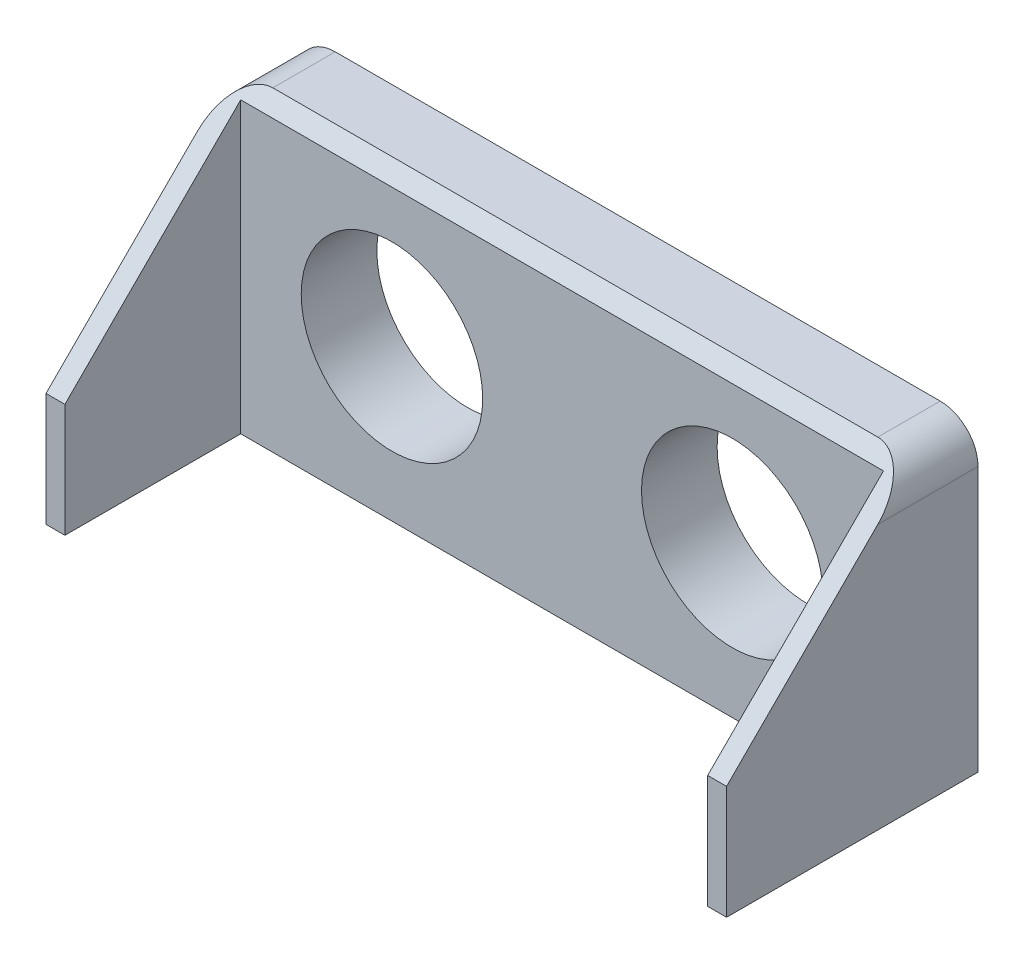
ISO-10303-21;
HEADER;
FILE_DESCRIPTION(('STEP AP214'),'2;1');
FILE_NAME('part.step','',(''),(''),'','','');
FILE_SCHEMA(('AUTOMOTIVE_DESIGN { 1 0 10303 214 1 1 1 1 }'));
ENDSEC;
DATA;
#1=APPLICATION_CONTEXT('core data for automotive mechanical design processes');
#2=APPLICATION_PROTOCOL_DEFINITION('international standard','automotive_design',2000,#1);
#3=PRODUCT_CONTEXT('',#1,'mechanical');
#4=PRODUCT('Part','Part','',(#3));
#5=PRODUCT_RELATED_PRODUCT_CATEGORY('part','',(#4));
#6=PRODUCT_DEFINITION_FORMATION('','',#4);
#7=PRODUCT_DEFINITION_CONTEXT('part definition',#1,'design');
#8=PRODUCT_DEFINITION('design','',#6,#7);
#9=PRODUCT_DEFINITION_SHAPE('','',#8);
#10=(LENGTH_UNIT() NAMED_UNIT(*) SI_UNIT(.MILLI.,.METRE.));
#11=(NAMED_UNIT(*) PLANE_ANGLE_UNIT() SI_UNIT($,.RADIAN.));
#12=(NAMED_UNIT(*) SI_UNIT($,.STERADIAN.) SOLID_ANGLE_UNIT());
#13=UNCERTAINTY_MEASURE_WITH_UNIT(LENGTH_MEASURE(1.E-05),#10,'distance_accuracy_value','');
#14=(GEOMETRIC_REPRESENTATION_CONTEXT(3) GLOBAL_UNCERTAINTY_ASSIGNED_CONTEXT((#13)) GLOBAL_UNIT_ASSIGNED_CONTEXT((#10,
#11,#12)) REPRESENTATION_CONTEXT('',''));
#15=CARTESIAN_POINT('',(0.,0.,0.));
#16=DIRECTION('',(0.,0.,1.));
#17=DIRECTION('',(1.,0.,0.));
#18=AXIS2_PLACEMENT_3D('',#15,#16,#17);
#19=CARTESIAN_POINT('',(1.,16.,0.));
#20=DIRECTION('',(0.,0.,-1.));
#21=DIRECTION('',(-1.,0.,0.));
#22=AXIS2_PLACEMENT_3D('',#19,#20,#21);
#23=PLANE('',#22);
#24=DIRECTION('',(0.,-1.,0.));
#25=VECTOR('',#24,1.);
#26=CARTESIAN_POINT('',(1.,16.,0.));
#27=LINE('',#26,#25);
#28=CARTESIAN_POINT('',(1.,5.99999999999997,0.));
#29=VERTEX_POINT('',#28);
#30=CARTESIAN_POINT('',(1.,0.,0.));
#31=VERTEX_POINT('',#30);
#32=EDGE_CURVE('E121',#29,#31,#27,.T.);
#33=ORIENTED_EDGE('',*,*,#32,.F.);
#34=DIRECTION('',(-1.,0.,0.));
#35=VECTOR('',#34,1.);
#36=CARTESIAN_POINT('',(1.,5.99999999999997,0.));
#37=LINE('',#36,#35);
#38=CARTESIAN_POINT('',(0.,5.99999999999997,0.));
#39=VERTEX_POINT('',#38);
#40=EDGE_CURVE('E194',#29,#39,#37,.T.);
#41=ORIENTED_EDGE('',*,*,#40,.T.);
#42=DIRECTION('',(0.,-1.,0.));
#43=VECTOR('',#42,1.);
#44=CARTESIAN_POINT('',(0.,16.,0.));
#45=LINE('',#44,#43);
#46=CARTESIAN_POINT('',(0.,0.,0.));
#47=VERTEX_POINT('',#46);
#48=EDGE_CURVE('E145',#39,#47,#45,.T.);
#49=ORIENTED_EDGE('',*,*,#48,.T.);
#50=DIRECTION('',(1.,0.,0.));
#51=VECTOR('',#50,1.);
#52=CARTESIAN_POINT('',(1.,0.,0.));
#53=LINE('',#52,#51);
#54=EDGE_CURVE('E139',#47,#31,#53,.T.);
#55=ORIENTED_EDGE('',*,*,#54,.T.);
#56=EDGE_LOOP('',(#33,#41,#49,#55));
#57=FACE_BOUND('',#56,.T.);
#58=ADVANCED_FACE('F37',(#57),#23,.F.);
#59=CARTESIAN_POINT('',(0.999999999999999,16.,-9.3));
#60=DIRECTION('',(-1.,0.,0.));
#61=DIRECTION('',(0.,0.,1.));
#62=AXIS2_PLACEMENT_3D('',#59,#60,#61);
#63=PLANE('',#62);
#64=DIRECTION('',(0.,-1.,0.));
#65=VECTOR('',#64,1.);
#66=CARTESIAN_POINT('',(0.999999999999999,16.,-9.3));
#67=LINE('',#66,#65);
#68=CARTESIAN_POINT('',(0.999999999999999,15.3,-9.3));
#69=VERTEX_POINT('',#68);
#70=CARTESIAN_POINT('',(0.999999999999999,0.,-9.3));
#71=VERTEX_POINT('',#70);
#72=EDGE_CURVE('E133',#69,#71,#67,.T.);
#73=ORIENTED_EDGE('',*,*,#72,.F.);
#74=DIRECTION('',(0.,0.707106781186549,-0.707106781186547));
#75=VECTOR('',#74,1.);
#76=CARTESIAN_POINT('',(0.999999999999999,16.,-10.));
#77=LINE('',#76,#75);
#78=EDGE_CURVE('E128',#69,#29,#77,.F.);
#79=ORIENTED_EDGE('',*,*,#78,.T.);
#80=ORIENTED_EDGE('',*,*,#32,.T.);
#81=DIRECTION('',(0.,0.,-1.));
#82=VECTOR('',#81,1.);
#83=CARTESIAN_POINT('',(0.999999999999999,0.,-9.3));
#84=LINE('',#83,#82);
#85=EDGE_CURVE('E125',#31,#71,#84,.T.);
#86=ORIENTED_EDGE('',*,*,#85,.T.);
#87=EDGE_LOOP('',(#73,#79,#80,#86));
#88=FACE_BOUND('',#87,.T.);
#89=ADVANCED_FACE('F124',(#88),#63,.F.);
#90=CARTESIAN_POINT('',(35.,16.,-9.3));
#91=DIRECTION('',(0.,0.,-1.));
#92=DIRECTION('',(-1.,0.,0.));
#93=AXIS2_PLACEMENT_3D('',#90,#91,#92);
#94=PLANE('',#93);
#95=CARTESIAN_POINT('',(27.,8.,-9.3));
#96=DIRECTION('',(0.,0.,-1.));
#97=DIRECTION('',(-1.,0.,0.));
#98=AXIS2_PLACEMENT_3D('',#95,#96,#97);
#99=CIRCLE('',#98,4.8);
#100=CARTESIAN_POINT('',(22.2,8.,-9.3));
#101=VERTEX_POINT('',#100);
#102=EDGE_CURVE('E147',#101,#101,#99,.T.);
#103=ORIENTED_EDGE('',*,*,#102,.T.);
#104=EDGE_LOOP('',(#103));
#105=FACE_BOUND('',#104,.T.);
#106=CARTESIAN_POINT('',(9.,8.,-9.3));
#107=DIRECTION('',(0.,0.,-1.));
#108=DIRECTION('',(-1.,0.,0.));
#109=AXIS2_PLACEMENT_3D('',#106,#107,#108);
#110=CIRCLE('',#109,4.8);
#111=CARTESIAN_POINT('',(4.2,8.,-9.3));
#112=VERTEX_POINT('',#111);
#113=EDGE_CURVE('E150',#112,#112,#110,.T.);
#114=ORIENTED_EDGE('',*,*,#113,.T.);
#115=EDGE_LOOP('',(#114));
#116=FACE_BOUND('',#115,.T.);
#117=DIRECTION('',(0.,-1.,0.));
#118=VECTOR('',#117,1.);
#119=CARTESIAN_POINT('',(35.,16.,-9.3));
#120=LINE('',#119,#118);
#121=CARTESIAN_POINT('',(35.,15.3,-9.3));
#122=VERTEX_POINT('',#121);
#123=CARTESIAN_POINT('',(35.,0.,-9.3));
#124=VERTEX_POINT('',#123);
#125=EDGE_CURVE('E179',#122,#124,#120,.T.);
#126=ORIENTED_EDGE('',*,*,#125,.F.);
#127=DIRECTION('',(1.,0.,0.));
#128=VECTOR('',#127,1.);
#129=CARTESIAN_POINT('',(0.,15.3,-9.3));
#130=LINE('',#129,#128);
#131=EDGE_CURVE('E191',#122,#69,#130,.F.);
#132=ORIENTED_EDGE('',*,*,#131,.T.);
#133=ORIENTED_EDGE('',*,*,#72,.T.);
#134=DIRECTION('',(1.,0.,0.));
#135=VECTOR('',#134,1.);
#136=CARTESIAN_POINT('',(35.,0.,-9.3));
#137=LINE('',#136,#135);
#138=EDGE_CURVE('E142',#71,#124,#137,.T.);
#139=ORIENTED_EDGE('',*,*,#138,.T.);
#140=EDGE_LOOP('',(#126,#132,#133,#139));
#141=FACE_BOUND('',#140,.T.);
#142=ADVANCED_FACE('F239',(#105,#116,#141),#94,.F.);
#143=CARTESIAN_POINT('',(35.,16.,0.));
#144=DIRECTION('',(1.,0.,0.));
#145=DIRECTION('',(0.,0.,-1.));
#146=AXIS2_PLACEMENT_3D('',#143,#144,#145);
#147=PLANE('',#146);
#148=DIRECTION('',(0.,-1.,0.));
#149=VECTOR('',#148,1.);
#150=CARTESIAN_POINT('',(35.,16.,0.));
#151=LINE('',#150,#149);
#152=CARTESIAN_POINT('',(35.,5.99999999999997,0.));
#153=VERTEX_POINT('',#152);
#154=CARTESIAN_POINT('',(35.,0.,0.));
#155=VERTEX_POINT('',#154);
#156=EDGE_CURVE('E177',#153,#155,#151,.T.);
#157=ORIENTED_EDGE('',*,*,#156,.F.);
#158=DIRECTION('',(0.,-0.707106781186549,0.707106781186547));
#159=VECTOR('',#158,1.);
#160=CARTESIAN_POINT('',(35.,16.,-10.));
#161=LINE('',#160,#159);
#162=EDGE_CURVE('E188',#153,#122,#161,.F.);
#163=ORIENTED_EDGE('',*,*,#162,.T.);
#164=ORIENTED_EDGE('',*,*,#125,.T.);
#165=DIRECTION('',(0.,0.,1.));
#166=VECTOR('',#165,1.);
#167=CARTESIAN_POINT('',(35.,0.,0.));
#168=LINE('',#167,#166);
#169=EDGE_CURVE('E156',#124,#155,#168,.T.);
#170=ORIENTED_EDGE('',*,*,#169,.T.);
#171=EDGE_LOOP('',(#157,#163,#164,#170));
#172=FACE_BOUND('',#171,.T.);
#173=ADVANCED_FACE('F238',(#172),#147,.F.);
#174=CARTESIAN_POINT('',(36.,16.,0.));
#175=DIRECTION('',(0.,0.,-1.));
#176=DIRECTION('',(-1.,0.,0.));
#177=AXIS2_PLACEMENT_3D('',#174,#175,#176);
#178=PLANE('',#177);
#179=DIRECTION('',(0.,-1.,0.));
#180=VECTOR('',#179,1.);
#181=CARTESIAN_POINT('',(36.,16.,0.));
#182=LINE('',#181,#180);
#183=CARTESIAN_POINT('',(36.,5.99999999999997,0.));
#184=VERTEX_POINT('',#183);
#185=CARTESIAN_POINT('',(36.,0.,0.));
#186=VERTEX_POINT('',#185);
#187=EDGE_CURVE('E175',#184,#186,#182,.T.);
#188=ORIENTED_EDGE('',*,*,#187,.F.);
#189=DIRECTION('',(-1.,0.,0.));
#190=VECTOR('',#189,1.);
#191=CARTESIAN_POINT('',(36.,5.99999999999997,0.));
#192=LINE('',#191,#190);
#193=EDGE_CURVE('E186',#184,#153,#192,.T.);
#194=ORIENTED_EDGE('',*,*,#193,.T.);
#195=ORIENTED_EDGE('',*,*,#156,.T.);
#196=DIRECTION('',(1.,0.,0.));
#197=VECTOR('',#196,1.);
#198=CARTESIAN_POINT('',(36.,0.,0.));
#199=LINE('',#198,#197);
#200=EDGE_CURVE('E159',#155,#186,#199,.T.);
#201=ORIENTED_EDGE('',*,*,#200,.T.);
#202=EDGE_LOOP('',(#188,#194,#195,#201));
#203=FACE_BOUND('',#202,.T.);
#204=ADVANCED_FACE('F241',(#203),#178,.F.);
#205=CARTESIAN_POINT('',(36.,16.,-13.3));
#206=DIRECTION('',(-1.,0.,0.));
#207=DIRECTION('',(0.,0.,1.));
#208=AXIS2_PLACEMENT_3D('',#205,#206,#207);
#209=PLANE('',#208);
#210=DIRECTION('',(0.,-1.,0.));
#211=VECTOR('',#210,1.);
#212=CARTESIAN_POINT('',(36.,16.,-13.3));
#213=LINE('',#212,#211);
#214=CARTESIAN_POINT('',(36.,14.,-13.3));
#215=VERTEX_POINT('',#214);
#216=CARTESIAN_POINT('',(36.,0.,-13.3));
#217=VERTEX_POINT('',#216);
#218=EDGE_CURVE('E173',#215,#217,#213,.T.);
#219=ORIENTED_EDGE('',*,*,#218,.F.);
#220=DIRECTION('',(0.,0.,-1.));
#221=VECTOR('',#220,1.);
#222=CARTESIAN_POINT('',(36.,14.,-13.3));
#223=LINE('',#222,#221);
#224=CARTESIAN_POINT('',(36.,14.,-8.00000000000001));
#225=VERTEX_POINT('',#224);
#226=EDGE_CURVE('E60',#215,#225,#223,.F.);
#227=ORIENTED_EDGE('',*,*,#226,.T.);
#228=DIRECTION('',(0.,0.707106781186549,-0.707106781186547));
#229=VECTOR('',#228,1.);
#230=CARTESIAN_POINT('',(36.,16.,-10.));
#231=LINE('',#230,#229);
#232=EDGE_CURVE('E184',#225,#184,#231,.F.);
#233=ORIENTED_EDGE('',*,*,#232,.T.);
#234=ORIENTED_EDGE('',*,*,#187,.T.);
#235=DIRECTION('',(0.,0.,-1.));
#236=VECTOR('',#235,1.);
#237=CARTESIAN_POINT('',(36.,0.,-13.3));
#238=LINE('',#237,#236);
#239=EDGE_CURVE('E162',#186,#217,#238,.T.);
#240=ORIENTED_EDGE('',*,*,#239,.T.);
#241=EDGE_LOOP('',(#219,#227,#233,#234,#240));
#242=FACE_BOUND('',#241,.T.);
#243=ADVANCED_FACE('F222',(#242),#209,.F.);
#244=CARTESIAN_POINT('',(0.,16.,-13.3));
#245=DIRECTION('',(0.,0.,1.));
#246=DIRECTION('',(1.,0.,0.));
#247=AXIS2_PLACEMENT_3D('',#244,#245,#246);
#248=PLANE('',#247);
#249=CARTESIAN_POINT('',(27.,8.,-13.3));
#250=DIRECTION('',(0.,0.,-1.));
#251=DIRECTION('',(-1.,0.,0.));
#252=AXIS2_PLACEMENT_3D('',#249,#250,#251);
#253=CIRCLE('',#252,4.8);
#254=CARTESIAN_POINT('',(22.2,8.,-13.3));
#255=VERTEX_POINT('',#254);
#256=EDGE_CURVE('E294',#255,#255,#253,.T.);
#257=ORIENTED_EDGE('',*,*,#256,.F.);
#258=EDGE_LOOP('',(#257));
#259=FACE_BOUND('',#258,.T.);
#260=CARTESIAN_POINT('',(9.,8.,-13.3));
#261=DIRECTION('',(0.,0.,-1.));
#262=DIRECTION('',(1.,0.,0.));
#263=AXIS2_PLACEMENT_3D('',#260,#261,#262);
#264=CIRCLE('',#263,4.8);
#265=CARTESIAN_POINT('',(13.8,8.,-13.3));
#266=VERTEX_POINT('',#265);
#267=EDGE_CURVE('E296',#266,#266,#264,.T.);
#268=ORIENTED_EDGE('',*,*,#267,.F.);
#269=EDGE_LOOP('',(#268));
#270=FACE_BOUND('',#269,.T.);
#271=DIRECTION('',(-1.,0.,0.));
#272=VECTOR('',#271,1.);
#273=CARTESIAN_POINT('',(0.,16.,-13.3));
#274=LINE('',#273,#272);
#275=CARTESIAN_POINT('',(34.,16.,-13.3));
#276=VERTEX_POINT('',#275);
#277=CARTESIAN_POINT('',(2.,16.,-13.3));
#278=VERTEX_POINT('',#277);
#279=EDGE_CURVE('E153',#276,#278,#274,.T.);
#280=ORIENTED_EDGE('',*,*,#279,.F.);
#281=CARTESIAN_POINT('',(34.,14.,-13.3));
#282=DIRECTION('',(0.,0.,1.));
#283=DIRECTION('',(1.,0.,0.));
#284=AXIS2_PLACEMENT_3D('',#281,#282,#283);
#285=CIRCLE('',#284,2.);
#286=EDGE_CURVE('E206',#276,#215,#285,.F.);
#287=ORIENTED_EDGE('',*,*,#286,.T.);
#288=ORIENTED_EDGE('',*,*,#218,.T.);
#289=DIRECTION('',(-1.,0.,0.));
#290=VECTOR('',#289,1.);
#291=CARTESIAN_POINT('',(0.,0.,-13.3));
#292=LINE('',#291,#290);
#293=CARTESIAN_POINT('',(0.,0.,-13.3));
#294=VERTEX_POINT('',#293);
#295=EDGE_CURVE('E165',#217,#294,#292,.T.);
#296=ORIENTED_EDGE('',*,*,#295,.T.);
#297=DIRECTION('',(0.,-1.,0.));
#298=VECTOR('',#297,1.);
#299=CARTESIAN_POINT('',(0.,16.,-13.3));
#300=LINE('',#299,#298);
#301=CARTESIAN_POINT('',(0.,14.,-13.3));
#302=VERTEX_POINT('',#301);
#303=EDGE_CURVE('E171',#302,#294,#300,.T.);
#304=ORIENTED_EDGE('',*,*,#303,.F.);
#305=CARTESIAN_POINT('',(2.,14.,-13.3));
#306=DIRECTION('',(0.,0.,1.));
#307=DIRECTION('',(1.,0.,0.));
#308=AXIS2_PLACEMENT_3D('',#305,#306,#307);
#309=CIRCLE('',#308,2.);
#310=EDGE_CURVE('E204',#302,#278,#309,.F.);
#311=ORIENTED_EDGE('',*,*,#310,.T.);
#312=EDGE_LOOP('',(#280,#287,#288,#296,#304,#311));
#313=FACE_BOUND('',#312,.T.);
#314=ADVANCED_FACE('F221',(#259,#270,#313),#248,.F.);
#315=CARTESIAN_POINT('',(0.,16.,0.));
#316=DIRECTION('',(1.,0.,0.));
#317=DIRECTION('',(0.,0.,-1.));
#318=AXIS2_PLACEMENT_3D('',#315,#316,#317);
#319=PLANE('',#318);
#320=DIRECTION('',(0.,-0.707106781186549,0.707106781186547));
#321=VECTOR('',#320,1.);
#322=CARTESIAN_POINT('',(0.,16.,-10.));
#323=LINE('',#322,#321);
#324=CARTESIAN_POINT('',(0.,14.,-8.00000000000001));
#325=VERTEX_POINT('',#324);
#326=EDGE_CURVE('E196',#39,#325,#323,.F.);
#327=ORIENTED_EDGE('',*,*,#326,.T.);
#328=DIRECTION('',(0.,0.,1.));
#329=VECTOR('',#328,1.);
#330=CARTESIAN_POINT('',(0.,14.,0.));
#331=LINE('',#330,#329);
#332=EDGE_CURVE('E11',#325,#302,#331,.F.);
#333=ORIENTED_EDGE('',*,*,#332,.T.);
#334=ORIENTED_EDGE('',*,*,#303,.T.);
#335=DIRECTION('',(0.,0.,1.));
#336=VECTOR('',#335,1.);
#337=CARTESIAN_POINT('',(0.,0.,0.));
#338=LINE('',#337,#336);
#339=EDGE_CURVE('E168',#294,#47,#338,.T.);
#340=ORIENTED_EDGE('',*,*,#339,.T.);
#341=ORIENTED_EDGE('',*,*,#48,.F.);
#342=EDGE_LOOP('',(#327,#333,#334,#340,#341));
#343=FACE_BOUND('',#342,.T.);
#344=ADVANCED_FACE('F232',(#343),#319,.F.);
#345=CARTESIAN_POINT('',(0.,16.,0.));
#346=DIRECTION('',(0.,-1.,0.));
#347=DIRECTION('',(0.,0.,-1.));
#348=AXIS2_PLACEMENT_3D('',#345,#346,#347);
#349=PLANE('',#348);
#350=DIRECTION('',(1.,0.,0.));
#351=VECTOR('',#350,1.);
#352=CARTESIAN_POINT('',(0.,16.,-10.));
#353=LINE('',#352,#351);
#354=CARTESIAN_POINT('',(2.,16.,-10.));
#355=VERTEX_POINT('',#354);
#356=CARTESIAN_POINT('',(34.,16.,-9.99999999999999));
#357=VERTEX_POINT('',#356);
#358=EDGE_CURVE('E132',#355,#357,#353,.T.);
#359=ORIENTED_EDGE('',*,*,#358,.T.);
#360=DIRECTION('',(0.,0.,-1.));
#361=VECTOR('',#360,1.);
#362=CARTESIAN_POINT('',(34.,16.,0.));
#363=LINE('',#362,#361);
#364=EDGE_CURVE('E201',#357,#276,#363,.T.);
#365=ORIENTED_EDGE('',*,*,#364,.T.);
#366=ORIENTED_EDGE('',*,*,#279,.T.);
#367=DIRECTION('',(0.,0.,1.));
#368=VECTOR('',#367,1.);
#369=CARTESIAN_POINT('',(2.,16.,0.));
#370=LINE('',#369,#368);
#371=EDGE_CURVE('E198',#278,#355,#370,.T.);
#372=ORIENTED_EDGE('',*,*,#371,.T.);
#373=EDGE_LOOP('',(#359,#365,#366,#372));
#374=FACE_BOUND('',#373,.T.);
#375=ADVANCED_FACE('F215',(#374),#349,.F.);
#376=CARTESIAN_POINT('',(0.,0.,0.));
#377=DIRECTION('',(0.,-1.,0.));
#378=DIRECTION('',(0.,0.,-1.));
#379=AXIS2_PLACEMENT_3D('',#376,#377,#378);
#380=PLANE('',#379);
#381=ORIENTED_EDGE('',*,*,#54,.F.);
#382=ORIENTED_EDGE('',*,*,#339,.F.);
#383=ORIENTED_EDGE('',*,*,#295,.F.);
#384=ORIENTED_EDGE('',*,*,#239,.F.);
#385=ORIENTED_EDGE('',*,*,#200,.F.);
#386=ORIENTED_EDGE('',*,*,#169,.F.);
#387=ORIENTED_EDGE('',*,*,#138,.F.);
#388=ORIENTED_EDGE('',*,*,#85,.F.);
#389=EDGE_LOOP('',(#381,#382,#383,#384,#385,#386,#387,#388));
#390=FACE_BOUND('',#389,.T.);
#391=ADVANCED_FACE('F137',(#390),#380,.T.);
#392=CARTESIAN_POINT('',(0.,16.,-10.));
#393=DIRECTION('',(0.,-0.707106781186546,-0.707106781186548));
#394=DIRECTION('',(1.,0.,0.));
#395=AXIS2_PLACEMENT_3D('',#392,#393,#394);
#396=PLANE('',#395);
#397=ORIENTED_EDGE('',*,*,#232,.F.);
#398=CARTESIAN_POINT('',(34.,14.,-8.));
#399=DIRECTION('',(0.,-0.707106781186546,-0.707106781186548));
#400=DIRECTION('',(0.,0.707106781186549,-0.707106781186547));
#401=AXIS2_PLACEMENT_3D('',#398,#399,#400);
#402=ELLIPSE('',#401,2.82842712474619,2.);
#403=EDGE_CURVE('E45',#225,#357,#402,.F.);
#404=ORIENTED_EDGE('',*,*,#403,.T.);
#405=ORIENTED_EDGE('',*,*,#358,.F.);
#406=CARTESIAN_POINT('',(2.,14.,-8.00000000000001));
#407=DIRECTION('',(0.,-0.707106781186546,-0.707106781186548));
#408=DIRECTION('',(0.,-0.707106781186549,0.707106781186547));
#409=AXIS2_PLACEMENT_3D('',#406,#407,#408);
#410=ELLIPSE('',#409,2.82842712474619,2.);
#411=EDGE_CURVE('E52',#355,#325,#410,.F.);
#412=ORIENTED_EDGE('',*,*,#411,.T.);
#413=ORIENTED_EDGE('',*,*,#326,.F.);
#414=ORIENTED_EDGE('',*,*,#40,.F.);
#415=ORIENTED_EDGE('',*,*,#78,.F.);
#416=ORIENTED_EDGE('',*,*,#131,.F.);
#417=ORIENTED_EDGE('',*,*,#162,.F.);
#418=ORIENTED_EDGE('',*,*,#193,.F.);
#419=EDGE_LOOP('',(#397,#404,#405,#412,#413,#414,#415,#416,#417,#418));
#420=FACE_BOUND('',#419,.T.);
#421=ADVANCED_FACE('F210',(#420),#396,.F.);
#422=CARTESIAN_POINT('',(34.,14.,0.));
#423=DIRECTION('',(0.,0.,-1.));
#424=DIRECTION('',(-1.,0.,0.));
#425=AXIS2_PLACEMENT_3D('',#422,#423,#424);
#426=CYLINDRICAL_SURFACE('',#425,2.);
#427=ORIENTED_EDGE('',*,*,#403,.F.);
#428=ORIENTED_EDGE('',*,*,#226,.F.);
#429=ORIENTED_EDGE('',*,*,#286,.F.);
#430=ORIENTED_EDGE('',*,*,#364,.F.);
#431=EDGE_LOOP('',(#427,#428,#429,#430));
#432=FACE_BOUND('',#431,.T.);
#433=ADVANCED_FACE('F219',(#432),#426,.T.);
#434=CARTESIAN_POINT('',(2.,14.,0.));
#435=DIRECTION('',(0.,0.,1.));
#436=DIRECTION('',(1.,0.,0.));
#437=AXIS2_PLACEMENT_3D('',#434,#435,#436);
#438=CYLINDRICAL_SURFACE('',#437,2.);
#439=ORIENTED_EDGE('',*,*,#310,.F.);
#440=ORIENTED_EDGE('',*,*,#332,.F.);
#441=ORIENTED_EDGE('',*,*,#411,.F.);
#442=ORIENTED_EDGE('',*,*,#371,.F.);
#443=EDGE_LOOP('',(#439,#440,#441,#442));
#444=FACE_BOUND('',#443,.T.);
#445=ADVANCED_FACE('F39',(#444),#438,.T.);
#446=CARTESIAN_POINT('',(9.,8.,0.));
#447=DIRECTION('',(0.,0.,-1.));
#448=DIRECTION('',(-1.,0.,0.));
#449=AXIS2_PLACEMENT_3D('',#446,#447,#448);
#450=CYLINDRICAL_SURFACE('',#449,4.8);
#451=ORIENTED_EDGE('',*,*,#267,.T.);
#452=EDGE_LOOP('',(#451));
#453=FACE_BOUND('',#452,.T.);
#454=ORIENTED_EDGE('',*,*,#113,.F.);
#455=EDGE_LOOP('',(#454));
#456=FACE_BOUND('',#455,.T.);
#457=ADVANCED_FACE('F266',(#453,#456),#450,.F.);
#458=CARTESIAN_POINT('',(27.,8.,0.));
#459=DIRECTION('',(0.,0.,-1.));
#460=DIRECTION('',(-1.,0.,0.));
#461=AXIS2_PLACEMENT_3D('',#458,#459,#460);
#462=CYLINDRICAL_SURFACE('',#461,4.8);
#463=ORIENTED_EDGE('',*,*,#256,.T.);
#464=EDGE_LOOP('',(#463));
#465=FACE_BOUND('',#464,.T.);
#466=ORIENTED_EDGE('',*,*,#102,.F.);
#467=EDGE_LOOP('',(#466));
#468=FACE_BOUND('',#467,.T.);
#469=ADVANCED_FACE('F270',(#465,#468),#462,.F.);
#470=CLOSED_SHELL('',(#58,#89,#142,#173,#204,#243,#314,#344,#375,#391,#421,#433,#445,#457,#469));
#471=MANIFOLD_SOLID_BREP('B2',#470);
#472=ADVANCED_BREP_SHAPE_REPRESENTATION('',(#18,#471),#14);
#473=SHAPE_DEFINITION_REPRESENTATION(#9,#472);
ENDSEC;
END-ISO-10303-21;
